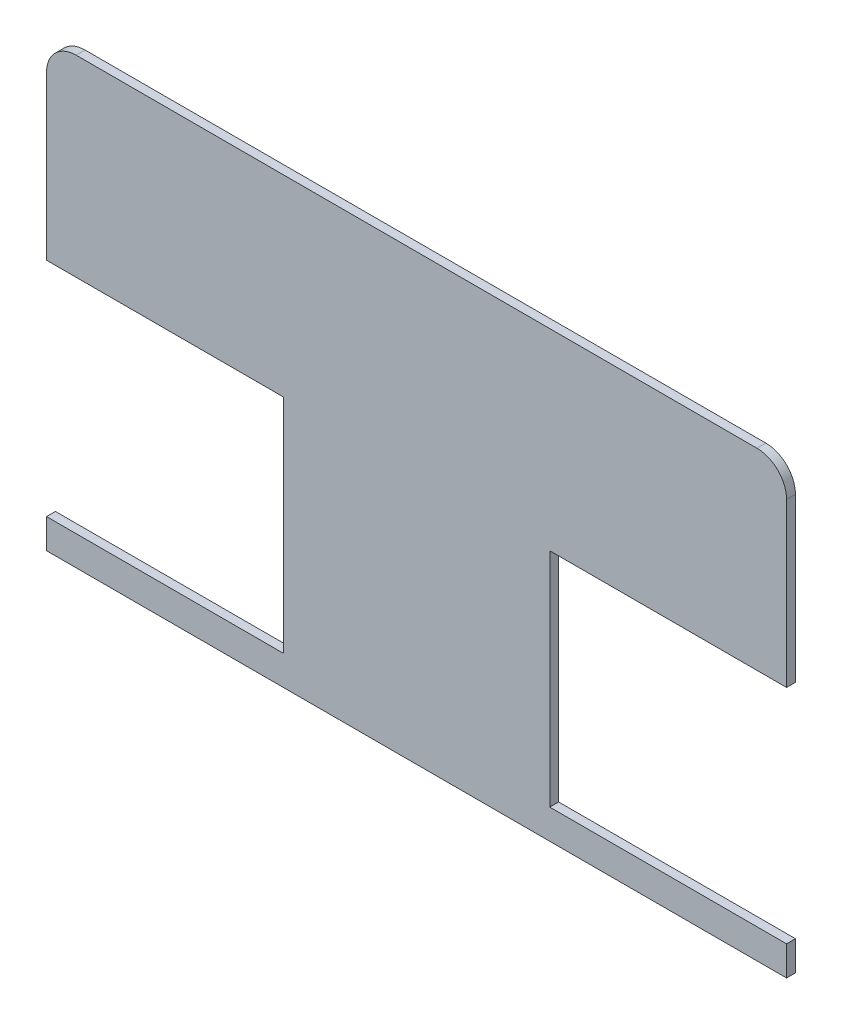
ISO-10303-21;
HEADER;
FILE_DESCRIPTION(('STEP AP214'),'2;1');
FILE_NAME('part.step','',(''),(''),'','','');
FILE_SCHEMA(('AUTOMOTIVE_DESIGN { 1 0 10303 214 1 1 1 1 }'));
ENDSEC;
DATA;
#1=APPLICATION_CONTEXT('core data for automotive mechanical design processes');
#2=APPLICATION_PROTOCOL_DEFINITION('international standard','automotive_design',2000,#1);
#3=PRODUCT_CONTEXT('',#1,'mechanical');
#4=PRODUCT('Part','Part','',(#3));
#5=PRODUCT_RELATED_PRODUCT_CATEGORY('part','',(#4));
#6=PRODUCT_DEFINITION_FORMATION('','',#4);
#7=PRODUCT_DEFINITION_CONTEXT('part definition',#1,'design');
#8=PRODUCT_DEFINITION('design','',#6,#7);
#9=PRODUCT_DEFINITION_SHAPE('','',#8);
#10=(LENGTH_UNIT() NAMED_UNIT(*) SI_UNIT(.MILLI.,.METRE.));
#11=(NAMED_UNIT(*) PLANE_ANGLE_UNIT() SI_UNIT($,.RADIAN.));
#12=(NAMED_UNIT(*) SI_UNIT($,.STERADIAN.) SOLID_ANGLE_UNIT());
#13=UNCERTAINTY_MEASURE_WITH_UNIT(LENGTH_MEASURE(1.E-05),#10,'distance_accuracy_value','');
#14=(GEOMETRIC_REPRESENTATION_CONTEXT(3) GLOBAL_UNCERTAINTY_ASSIGNED_CONTEXT((#13)) GLOBAL_UNIT_ASSIGNED_CONTEXT((#10,
#11,#12)) REPRESENTATION_CONTEXT('',''));
#15=CARTESIAN_POINT('',(0.,0.,0.));
#16=DIRECTION('',(0.,0.,1.));
#17=DIRECTION('',(1.,0.,0.));
#18=AXIS2_PLACEMENT_3D('',#15,#16,#17);
#19=CARTESIAN_POINT('',(170.,-140.,3.));
#20=DIRECTION('',(0.,-1.,0.));
#21=DIRECTION('',(0.,0.,-1.));
#22=AXIS2_PLACEMENT_3D('',#19,#20,#21);
#23=PLANE('',#22);
#24=DIRECTION('',(-1.,0.,0.));
#25=VECTOR('',#24,1.);
#26=CARTESIAN_POINT('',(170.,-140.,0.));
#27=LINE('',#26,#25);
#28=CARTESIAN_POINT('',(250.,-140.,0.));
#29=VERTEX_POINT('',#28);
#30=CARTESIAN_POINT('',(170.,-140.,0.));
#31=VERTEX_POINT('',#30);
#32=EDGE_CURVE('E176',#29,#31,#27,.T.);
#33=ORIENTED_EDGE('',*,*,#32,.T.);
#34=DIRECTION('',(0.,0.,-1.));
#35=VECTOR('',#34,1.);
#36=CARTESIAN_POINT('',(170.,-140.,3.));
#37=LINE('',#36,#35);
#38=CARTESIAN_POINT('',(170.,-140.,3.));
#39=VERTEX_POINT('',#38);
#40=EDGE_CURVE('E11',#39,#31,#37,.T.);
#41=ORIENTED_EDGE('',*,*,#40,.F.);
#42=DIRECTION('',(-1.,0.,0.));
#43=VECTOR('',#42,1.);
#44=CARTESIAN_POINT('',(170.,-140.,3.));
#45=LINE('',#44,#43);
#46=CARTESIAN_POINT('',(250.,-140.,3.));
#47=VERTEX_POINT('',#46);
#48=EDGE_CURVE('E216',#47,#39,#45,.T.);
#49=ORIENTED_EDGE('',*,*,#48,.F.);
#50=DIRECTION('',(0.,0.,-1.));
#51=VECTOR('',#50,1.);
#52=CARTESIAN_POINT('',(250.,-140.,3.));
#53=LINE('',#52,#51);
#54=EDGE_CURVE('E172',#47,#29,#53,.T.);
#55=ORIENTED_EDGE('',*,*,#54,.T.);
#56=EDGE_LOOP('',(#33,#41,#49,#55));
#57=FACE_BOUND('',#56,.T.);
#58=ADVANCED_FACE('F39',(#57),#23,.F.);
#59=CARTESIAN_POINT('',(170.,-65.,3.));
#60=DIRECTION('',(-1.,0.,0.));
#61=DIRECTION('',(0.,-1.,0.));
#62=AXIS2_PLACEMENT_3D('',#59,#60,#61);
#63=PLANE('',#62);
#64=DIRECTION('',(0.,1.,0.));
#65=VECTOR('',#64,1.);
#66=CARTESIAN_POINT('',(170.,-65.,0.));
#67=LINE('',#66,#65);
#68=CARTESIAN_POINT('',(170.,-65.,0.));
#69=VERTEX_POINT('',#68);
#70=EDGE_CURVE('E180',#31,#69,#67,.T.);
#71=ORIENTED_EDGE('',*,*,#70,.T.);
#72=DIRECTION('',(0.,0.,-1.));
#73=VECTOR('',#72,1.);
#74=CARTESIAN_POINT('',(170.,-65.,3.));
#75=LINE('',#74,#73);
#76=CARTESIAN_POINT('',(170.,-65.,3.));
#77=VERTEX_POINT('',#76);
#78=EDGE_CURVE('E48',#77,#69,#75,.T.);
#79=ORIENTED_EDGE('',*,*,#78,.F.);
#80=DIRECTION('',(0.,1.,0.));
#81=VECTOR('',#80,1.);
#82=CARTESIAN_POINT('',(170.,-65.,3.));
#83=LINE('',#82,#81);
#84=EDGE_CURVE('E117',#39,#77,#83,.T.);
#85=ORIENTED_EDGE('',*,*,#84,.F.);
#86=ORIENTED_EDGE('',*,*,#40,.T.);
#87=EDGE_LOOP('',(#71,#79,#85,#86));
#88=FACE_BOUND('',#87,.T.);
#89=ADVANCED_FACE('F324',(#88),#63,.F.);
#90=CARTESIAN_POINT('',(250.,-65.,3.));
#91=DIRECTION('',(0.,1.,0.));
#92=DIRECTION('',(-1.,0.,0.));
#93=AXIS2_PLACEMENT_3D('',#90,#91,#92);
#94=PLANE('',#93);
#95=DIRECTION('',(1.,0.,0.));
#96=VECTOR('',#95,1.);
#97=CARTESIAN_POINT('',(250.,-65.,0.));
#98=LINE('',#97,#96);
#99=CARTESIAN_POINT('',(250.,-65.,0.));
#100=VERTEX_POINT('',#99);
#101=EDGE_CURVE('E183',#69,#100,#98,.T.);
#102=ORIENTED_EDGE('',*,*,#101,.T.);
#103=DIRECTION('',(0.,0.,-1.));
#104=VECTOR('',#103,1.);
#105=CARTESIAN_POINT('',(250.,-65.,3.));
#106=LINE('',#105,#104);
#107=CARTESIAN_POINT('',(250.,-65.,3.));
#108=VERTEX_POINT('',#107);
#109=EDGE_CURVE('E251',#108,#100,#106,.T.);
#110=ORIENTED_EDGE('',*,*,#109,.F.);
#111=DIRECTION('',(1.,0.,0.));
#112=VECTOR('',#111,1.);
#113=CARTESIAN_POINT('',(250.,-65.,3.));
#114=LINE('',#113,#112);
#115=EDGE_CURVE('E261',#77,#108,#114,.T.);
#116=ORIENTED_EDGE('',*,*,#115,.F.);
#117=ORIENTED_EDGE('',*,*,#78,.T.);
#118=EDGE_LOOP('',(#102,#110,#116,#117));
#119=FACE_BOUND('',#118,.T.);
#120=ADVANCED_FACE('F259',(#119),#94,.F.);
#121=CARTESIAN_POINT('',(250.,-10.0000000000001,3.));
#122=DIRECTION('',(-1.,0.,0.));
#123=DIRECTION('',(0.,0.,1.));
#124=AXIS2_PLACEMENT_3D('',#121,#122,#123);
#125=PLANE('',#124);
#126=DIRECTION('',(0.,1.,0.));
#127=VECTOR('',#126,1.);
#128=CARTESIAN_POINT('',(250.,-10.0000000000001,0.));
#129=LINE('',#128,#127);
#130=CARTESIAN_POINT('',(250.,-10.0000000000001,0.));
#131=VERTEX_POINT('',#130);
#132=EDGE_CURVE('E186',#100,#131,#129,.T.);
#133=ORIENTED_EDGE('',*,*,#132,.T.);
#134=DIRECTION('',(0.,0.,-1.));
#135=VECTOR('',#134,1.);
#136=CARTESIAN_POINT('',(250.,-10.0000000000001,3.));
#137=LINE('',#136,#135);
#138=CARTESIAN_POINT('',(250.,-10.0000000000001,3.));
#139=VERTEX_POINT('',#138);
#140=EDGE_CURVE('E247',#139,#131,#137,.T.);
#141=ORIENTED_EDGE('',*,*,#140,.F.);
#142=DIRECTION('',(0.,1.,0.));
#143=VECTOR('',#142,1.);
#144=CARTESIAN_POINT('',(250.,-10.0000000000001,3.));
#145=LINE('',#144,#143);
#146=EDGE_CURVE('E280',#108,#139,#145,.T.);
#147=ORIENTED_EDGE('',*,*,#146,.F.);
#148=ORIENTED_EDGE('',*,*,#109,.T.);
#149=EDGE_LOOP('',(#133,#141,#147,#148));
#150=FACE_BOUND('',#149,.T.);
#151=ADVANCED_FACE('F270',(#150),#125,.F.);
#152=CARTESIAN_POINT('',(240.,-10.,3.));
#153=DIRECTION('',(0.,0.,-1.));
#154=DIRECTION('',(-1.,0.,0.));
#155=AXIS2_PLACEMENT_3D('',#152,#153,#154);
#156=CYLINDRICAL_SURFACE('',#155,10.);
#157=CARTESIAN_POINT('',(240.,-10.,0.));
#158=DIRECTION('',(0.,0.,1.));
#159=DIRECTION('',(-1.,0.,0.));
#160=AXIS2_PLACEMENT_3D('',#157,#158,#159);
#161=CIRCLE('',#160,10.);
#162=CARTESIAN_POINT('',(240.,0.,0.));
#163=VERTEX_POINT('',#162);
#164=EDGE_CURVE('E189',#131,#163,#161,.T.);
#165=ORIENTED_EDGE('',*,*,#164,.T.);
#166=DIRECTION('',(0.,0.,-1.));
#167=VECTOR('',#166,1.);
#168=CARTESIAN_POINT('',(240.,0.,3.));
#169=LINE('',#168,#167);
#170=CARTESIAN_POINT('',(240.,0.,3.));
#171=VERTEX_POINT('',#170);
#172=EDGE_CURVE('E243',#171,#163,#169,.T.);
#173=ORIENTED_EDGE('',*,*,#172,.F.);
#174=CARTESIAN_POINT('',(240.,-10.,3.));
#175=DIRECTION('',(0.,0.,1.));
#176=DIRECTION('',(-1.,0.,0.));
#177=AXIS2_PLACEMENT_3D('',#174,#175,#176);
#178=CIRCLE('',#177,10.);
#179=EDGE_CURVE('E276',#139,#171,#178,.T.);
#180=ORIENTED_EDGE('',*,*,#179,.F.);
#181=ORIENTED_EDGE('',*,*,#140,.T.);
#182=EDGE_LOOP('',(#165,#173,#180,#181));
#183=FACE_BOUND('',#182,.T.);
#184=ADVANCED_FACE('F274',(#183),#156,.T.);
#185=CARTESIAN_POINT('',(10.0000000000001,0.,3.));
#186=DIRECTION('',(0.,-1.,0.));
#187=DIRECTION('',(0.,0.,-1.));
#188=AXIS2_PLACEMENT_3D('',#185,#186,#187);
#189=PLANE('',#188);
#190=DIRECTION('',(-1.,0.,0.));
#191=VECTOR('',#190,1.);
#192=CARTESIAN_POINT('',(10.0000000000001,0.,0.));
#193=LINE('',#192,#191);
#194=CARTESIAN_POINT('',(10.0000000000001,0.,0.));
#195=VERTEX_POINT('',#194);
#196=EDGE_CURVE('E192',#163,#195,#193,.T.);
#197=ORIENTED_EDGE('',*,*,#196,.T.);
#198=DIRECTION('',(0.,0.,-1.));
#199=VECTOR('',#198,1.);
#200=CARTESIAN_POINT('',(10.0000000000001,0.,3.));
#201=LINE('',#200,#199);
#202=CARTESIAN_POINT('',(10.0000000000001,0.,3.));
#203=VERTEX_POINT('',#202);
#204=EDGE_CURVE('E239',#203,#195,#201,.T.);
#205=ORIENTED_EDGE('',*,*,#204,.F.);
#206=DIRECTION('',(-1.,0.,0.));
#207=VECTOR('',#206,1.);
#208=CARTESIAN_POINT('',(10.0000000000001,0.,3.));
#209=LINE('',#208,#207);
#210=EDGE_CURVE('E279',#171,#203,#209,.T.);
#211=ORIENTED_EDGE('',*,*,#210,.F.);
#212=ORIENTED_EDGE('',*,*,#172,.T.);
#213=EDGE_LOOP('',(#197,#205,#211,#212));
#214=FACE_BOUND('',#213,.T.);
#215=ADVANCED_FACE('F337',(#214),#189,.F.);
#216=CARTESIAN_POINT('',(10.,-10.,3.));
#217=DIRECTION('',(0.,0.,-1.));
#218=DIRECTION('',(-1.,0.,0.));
#219=AXIS2_PLACEMENT_3D('',#216,#217,#218);
#220=CYLINDRICAL_SURFACE('',#219,10.);
#221=CARTESIAN_POINT('',(10.,-10.,0.));
#222=DIRECTION('',(0.,0.,1.));
#223=DIRECTION('',(1.,0.,0.));
#224=AXIS2_PLACEMENT_3D('',#221,#222,#223);
#225=CIRCLE('',#224,10.);
#226=CARTESIAN_POINT('',(0.,-10.0000000000001,0.));
#227=VERTEX_POINT('',#226);
#228=EDGE_CURVE('E195',#195,#227,#225,.T.);
#229=ORIENTED_EDGE('',*,*,#228,.T.);
#230=DIRECTION('',(0.,0.,-1.));
#231=VECTOR('',#230,1.);
#232=CARTESIAN_POINT('',(0.,-10.0000000000001,3.));
#233=LINE('',#232,#231);
#234=CARTESIAN_POINT('',(0.,-10.0000000000001,3.));
#235=VERTEX_POINT('',#234);
#236=EDGE_CURVE('E235',#235,#227,#233,.T.);
#237=ORIENTED_EDGE('',*,*,#236,.F.);
#238=CARTESIAN_POINT('',(10.,-10.,3.));
#239=DIRECTION('',(0.,0.,1.));
#240=DIRECTION('',(1.,0.,0.));
#241=AXIS2_PLACEMENT_3D('',#238,#239,#240);
#242=CIRCLE('',#241,10.);
#243=EDGE_CURVE('E284',#203,#235,#242,.T.);
#244=ORIENTED_EDGE('',*,*,#243,.F.);
#245=ORIENTED_EDGE('',*,*,#204,.T.);
#246=EDGE_LOOP('',(#229,#237,#244,#245));
#247=FACE_BOUND('',#246,.T.);
#248=ADVANCED_FACE('F340',(#247),#220,.T.);
#249=CARTESIAN_POINT('',(0.,-65.,3.));
#250=DIRECTION('',(1.,0.,0.));
#251=DIRECTION('',(0.,1.,0.));
#252=AXIS2_PLACEMENT_3D('',#249,#250,#251);
#253=PLANE('',#252);
#254=DIRECTION('',(0.,-1.,0.));
#255=VECTOR('',#254,1.);
#256=CARTESIAN_POINT('',(0.,-65.,0.));
#257=LINE('',#256,#255);
#258=CARTESIAN_POINT('',(0.,-65.,0.));
#259=VERTEX_POINT('',#258);
#260=EDGE_CURVE('E198',#227,#259,#257,.T.);
#261=ORIENTED_EDGE('',*,*,#260,.T.);
#262=DIRECTION('',(0.,0.,-1.));
#263=VECTOR('',#262,1.);
#264=CARTESIAN_POINT('',(0.,-65.,3.));
#265=LINE('',#264,#263);
#266=CARTESIAN_POINT('',(0.,-65.,3.));
#267=VERTEX_POINT('',#266);
#268=EDGE_CURVE('E231',#267,#259,#265,.T.);
#269=ORIENTED_EDGE('',*,*,#268,.F.);
#270=DIRECTION('',(0.,-1.,0.));
#271=VECTOR('',#270,1.);
#272=CARTESIAN_POINT('',(0.,-65.,3.));
#273=LINE('',#272,#271);
#274=EDGE_CURVE('E291',#235,#267,#273,.T.);
#275=ORIENTED_EDGE('',*,*,#274,.F.);
#276=ORIENTED_EDGE('',*,*,#236,.T.);
#277=EDGE_LOOP('',(#261,#269,#275,#276));
#278=FACE_BOUND('',#277,.T.);
#279=ADVANCED_FACE('F344',(#278),#253,.F.);
#280=CARTESIAN_POINT('',(80.,-65.,3.));
#281=DIRECTION('',(0.,1.,0.));
#282=DIRECTION('',(0.,0.,1.));
#283=AXIS2_PLACEMENT_3D('',#280,#281,#282);
#284=PLANE('',#283);
#285=DIRECTION('',(1.,0.,0.));
#286=VECTOR('',#285,1.);
#287=CARTESIAN_POINT('',(80.,-65.,0.));
#288=LINE('',#287,#286);
#289=CARTESIAN_POINT('',(80.,-65.,0.));
#290=VERTEX_POINT('',#289);
#291=EDGE_CURVE('E201',#259,#290,#288,.T.);
#292=ORIENTED_EDGE('',*,*,#291,.T.);
#293=DIRECTION('',(0.,0.,-1.));
#294=VECTOR('',#293,1.);
#295=CARTESIAN_POINT('',(80.,-65.,3.));
#296=LINE('',#295,#294);
#297=CARTESIAN_POINT('',(80.,-65.,3.));
#298=VERTEX_POINT('',#297);
#299=EDGE_CURVE('E227',#298,#290,#296,.T.);
#300=ORIENTED_EDGE('',*,*,#299,.F.);
#301=DIRECTION('',(1.,0.,0.));
#302=VECTOR('',#301,1.);
#303=CARTESIAN_POINT('',(80.,-65.,3.));
#304=LINE('',#303,#302);
#305=EDGE_CURVE('E294',#267,#298,#304,.T.);
#306=ORIENTED_EDGE('',*,*,#305,.F.);
#307=ORIENTED_EDGE('',*,*,#268,.T.);
#308=EDGE_LOOP('',(#292,#300,#306,#307));
#309=FACE_BOUND('',#308,.T.);
#310=ADVANCED_FACE('F348',(#309),#284,.F.);
#311=CARTESIAN_POINT('',(80.,-140.,3.));
#312=DIRECTION('',(1.,0.,0.));
#313=DIRECTION('',(0.,1.,0.));
#314=AXIS2_PLACEMENT_3D('',#311,#312,#313);
#315=PLANE('',#314);
#316=DIRECTION('',(0.,-1.,0.));
#317=VECTOR('',#316,1.);
#318=CARTESIAN_POINT('',(80.,-140.,0.));
#319=LINE('',#318,#317);
#320=CARTESIAN_POINT('',(80.,-140.,0.));
#321=VERTEX_POINT('',#320);
#322=EDGE_CURVE('E204',#290,#321,#319,.T.);
#323=ORIENTED_EDGE('',*,*,#322,.T.);
#324=DIRECTION('',(0.,0.,-1.));
#325=VECTOR('',#324,1.);
#326=CARTESIAN_POINT('',(80.,-140.,3.));
#327=LINE('',#326,#325);
#328=CARTESIAN_POINT('',(80.,-140.,3.));
#329=VERTEX_POINT('',#328);
#330=EDGE_CURVE('E223',#329,#321,#327,.T.);
#331=ORIENTED_EDGE('',*,*,#330,.F.);
#332=DIRECTION('',(0.,-1.,0.));
#333=VECTOR('',#332,1.);
#334=CARTESIAN_POINT('',(80.,-140.,3.));
#335=LINE('',#334,#333);
#336=EDGE_CURVE('E297',#298,#329,#335,.T.);
#337=ORIENTED_EDGE('',*,*,#336,.F.);
#338=ORIENTED_EDGE('',*,*,#299,.T.);
#339=EDGE_LOOP('',(#323,#331,#337,#338));
#340=FACE_BOUND('',#339,.T.);
#341=ADVANCED_FACE('F305',(#340),#315,.F.);
#342=CARTESIAN_POINT('',(0.,-140.,3.));
#343=DIRECTION('',(0.,-1.,0.));
#344=DIRECTION('',(0.,0.,-1.));
#345=AXIS2_PLACEMENT_3D('',#342,#343,#344);
#346=PLANE('',#345);
#347=DIRECTION('',(-1.,0.,0.));
#348=VECTOR('',#347,1.);
#349=CARTESIAN_POINT('',(0.,-140.,0.));
#350=LINE('',#349,#348);
#351=CARTESIAN_POINT('',(0.,-140.,0.));
#352=VERTEX_POINT('',#351);
#353=EDGE_CURVE('E207',#321,#352,#350,.T.);
#354=ORIENTED_EDGE('',*,*,#353,.T.);
#355=DIRECTION('',(0.,0.,-1.));
#356=VECTOR('',#355,1.);
#357=CARTESIAN_POINT('',(0.,-140.,3.));
#358=LINE('',#357,#356);
#359=CARTESIAN_POINT('',(0.,-140.,3.));
#360=VERTEX_POINT('',#359);
#361=EDGE_CURVE('E165',#360,#352,#358,.T.);
#362=ORIENTED_EDGE('',*,*,#361,.F.);
#363=DIRECTION('',(-1.,0.,0.));
#364=VECTOR('',#363,1.);
#365=CARTESIAN_POINT('',(0.,-140.,3.));
#366=LINE('',#365,#364);
#367=EDGE_CURVE('E154',#329,#360,#366,.T.);
#368=ORIENTED_EDGE('',*,*,#367,.F.);
#369=ORIENTED_EDGE('',*,*,#330,.T.);
#370=EDGE_LOOP('',(#354,#362,#368,#369));
#371=FACE_BOUND('',#370,.T.);
#372=ADVANCED_FACE('F309',(#371),#346,.F.);
#373=CARTESIAN_POINT('',(0.,-150.,3.));
#374=DIRECTION('',(1.,0.,0.));
#375=DIRECTION('',(0.,1.,0.));
#376=AXIS2_PLACEMENT_3D('',#373,#374,#375);
#377=PLANE('',#376);
#378=DIRECTION('',(0.,-1.,0.));
#379=VECTOR('',#378,1.);
#380=CARTESIAN_POINT('',(0.,-150.,0.));
#381=LINE('',#380,#379);
#382=CARTESIAN_POINT('',(0.,-150.,0.));
#383=VERTEX_POINT('',#382);
#384=EDGE_CURVE('E163',#352,#383,#381,.T.);
#385=ORIENTED_EDGE('',*,*,#384,.T.);
#386=DIRECTION('',(0.,0.,-1.));
#387=VECTOR('',#386,1.);
#388=CARTESIAN_POINT('',(0.,-150.,3.));
#389=LINE('',#388,#387);
#390=CARTESIAN_POINT('',(0.,-150.,3.));
#391=VERTEX_POINT('',#390);
#392=EDGE_CURVE('E160',#391,#383,#389,.T.);
#393=ORIENTED_EDGE('',*,*,#392,.F.);
#394=DIRECTION('',(0.,-1.,0.));
#395=VECTOR('',#394,1.);
#396=CARTESIAN_POINT('',(0.,-150.,3.));
#397=LINE('',#396,#395);
#398=EDGE_CURVE('E148',#360,#391,#397,.T.);
#399=ORIENTED_EDGE('',*,*,#398,.F.);
#400=ORIENTED_EDGE('',*,*,#361,.T.);
#401=EDGE_LOOP('',(#385,#393,#399,#400));
#402=FACE_BOUND('',#401,.T.);
#403=ADVANCED_FACE('F161',(#402),#377,.F.);
#404=CARTESIAN_POINT('',(250.,-150.,3.));
#405=DIRECTION('',(0.,1.,0.));
#406=DIRECTION('',(-1.,0.,0.));
#407=AXIS2_PLACEMENT_3D('',#404,#405,#406);
#408=PLANE('',#407);
#409=DIRECTION('',(1.,0.,0.));
#410=VECTOR('',#409,1.);
#411=CARTESIAN_POINT('',(250.,-150.,0.));
#412=LINE('',#411,#410);
#413=CARTESIAN_POINT('',(250.,-150.,0.));
#414=VERTEX_POINT('',#413);
#415=EDGE_CURVE('E103',#383,#414,#412,.T.);
#416=ORIENTED_EDGE('',*,*,#415,.T.);
#417=DIRECTION('',(0.,0.,-1.));
#418=VECTOR('',#417,1.);
#419=CARTESIAN_POINT('',(250.,-150.,3.));
#420=LINE('',#419,#418);
#421=CARTESIAN_POINT('',(250.,-150.,3.));
#422=VERTEX_POINT('',#421);
#423=EDGE_CURVE('E166',#422,#414,#420,.T.);
#424=ORIENTED_EDGE('',*,*,#423,.F.);
#425=DIRECTION('',(1.,0.,0.));
#426=VECTOR('',#425,1.);
#427=CARTESIAN_POINT('',(250.,-150.,3.));
#428=LINE('',#427,#426);
#429=EDGE_CURVE('E152',#391,#422,#428,.T.);
#430=ORIENTED_EDGE('',*,*,#429,.F.);
#431=ORIENTED_EDGE('',*,*,#392,.T.);
#432=EDGE_LOOP('',(#416,#424,#430,#431));
#433=FACE_BOUND('',#432,.T.);
#434=ADVANCED_FACE('F168',(#433),#408,.F.);
#435=CARTESIAN_POINT('',(250.,-140.,3.));
#436=DIRECTION('',(-1.,0.,0.));
#437=DIRECTION('',(0.,0.,1.));
#438=AXIS2_PLACEMENT_3D('',#435,#436,#437);
#439=PLANE('',#438);
#440=DIRECTION('',(0.,1.,0.));
#441=VECTOR('',#440,1.);
#442=CARTESIAN_POINT('',(250.,-140.,0.));
#443=LINE('',#442,#441);
#444=EDGE_CURVE('E109',#414,#29,#443,.T.);
#445=ORIENTED_EDGE('',*,*,#444,.T.);
#446=ORIENTED_EDGE('',*,*,#54,.F.);
#447=DIRECTION('',(0.,1.,0.));
#448=VECTOR('',#447,1.);
#449=CARTESIAN_POINT('',(250.,-140.,3.));
#450=LINE('',#449,#448);
#451=EDGE_CURVE('E56',#422,#47,#450,.T.);
#452=ORIENTED_EDGE('',*,*,#451,.F.);
#453=ORIENTED_EDGE('',*,*,#423,.T.);
#454=EDGE_LOOP('',(#445,#446,#452,#453));
#455=FACE_BOUND('',#454,.T.);
#456=ADVANCED_FACE('F313',(#455),#439,.F.);
#457=CARTESIAN_POINT('',(10.,-10.,3.));
#458=DIRECTION('',(0.,0.,1.));
#459=DIRECTION('',(1.,0.,0.));
#460=AXIS2_PLACEMENT_3D('',#457,#458,#459);
#461=PLANE('',#460);
#462=ORIENTED_EDGE('',*,*,#48,.T.);
#463=ORIENTED_EDGE('',*,*,#84,.T.);
#464=ORIENTED_EDGE('',*,*,#115,.T.);
#465=ORIENTED_EDGE('',*,*,#146,.T.);
#466=ORIENTED_EDGE('',*,*,#179,.T.);
#467=ORIENTED_EDGE('',*,*,#210,.T.);
#468=ORIENTED_EDGE('',*,*,#243,.T.);
#469=ORIENTED_EDGE('',*,*,#274,.T.);
#470=ORIENTED_EDGE('',*,*,#305,.T.);
#471=ORIENTED_EDGE('',*,*,#336,.T.);
#472=ORIENTED_EDGE('',*,*,#367,.T.);
#473=ORIENTED_EDGE('',*,*,#398,.T.);
#474=ORIENTED_EDGE('',*,*,#429,.T.);
#475=ORIENTED_EDGE('',*,*,#451,.T.);
#476=EDGE_LOOP('',(#462,#463,#464,#465,#466,#467,#468,#469,#470,#471,#472,#473,#474,#475));
#477=FACE_BOUND('',#476,.T.);
#478=ADVANCED_FACE('F150',(#477),#461,.T.);
#479=CARTESIAN_POINT('',(10.,-10.,0.));
#480=DIRECTION('',(0.,0.,1.));
#481=DIRECTION('',(1.,0.,0.));
#482=AXIS2_PLACEMENT_3D('',#479,#480,#481);
#483=PLANE('',#482);
#484=ORIENTED_EDGE('',*,*,#32,.F.);
#485=ORIENTED_EDGE('',*,*,#444,.F.);
#486=ORIENTED_EDGE('',*,*,#415,.F.);
#487=ORIENTED_EDGE('',*,*,#384,.F.);
#488=ORIENTED_EDGE('',*,*,#353,.F.);
#489=ORIENTED_EDGE('',*,*,#322,.F.);
#490=ORIENTED_EDGE('',*,*,#291,.F.);
#491=ORIENTED_EDGE('',*,*,#260,.F.);
#492=ORIENTED_EDGE('',*,*,#228,.F.);
#493=ORIENTED_EDGE('',*,*,#196,.F.);
#494=ORIENTED_EDGE('',*,*,#164,.F.);
#495=ORIENTED_EDGE('',*,*,#132,.F.);
#496=ORIENTED_EDGE('',*,*,#101,.F.);
#497=ORIENTED_EDGE('',*,*,#70,.F.);
#498=EDGE_LOOP('',(#484,#485,#486,#487,#488,#489,#490,#491,#492,#493,#494,#495,#496,#497));
#499=FACE_BOUND('',#498,.T.);
#500=ADVANCED_FACE('F265',(#499),#483,.F.);
#501=CLOSED_SHELL('',(#58,#89,#120,#151,#184,#215,#248,#279,#310,#341,#372,#403,#434,#456,#478,#500));
#502=MANIFOLD_SOLID_BREP('B2',#501);
#503=ADVANCED_BREP_SHAPE_REPRESENTATION('',(#18,#502),#14);
#504=SHAPE_DEFINITION_REPRESENTATION(#9,#503);
ENDSEC;
END-ISO-10303-21;
